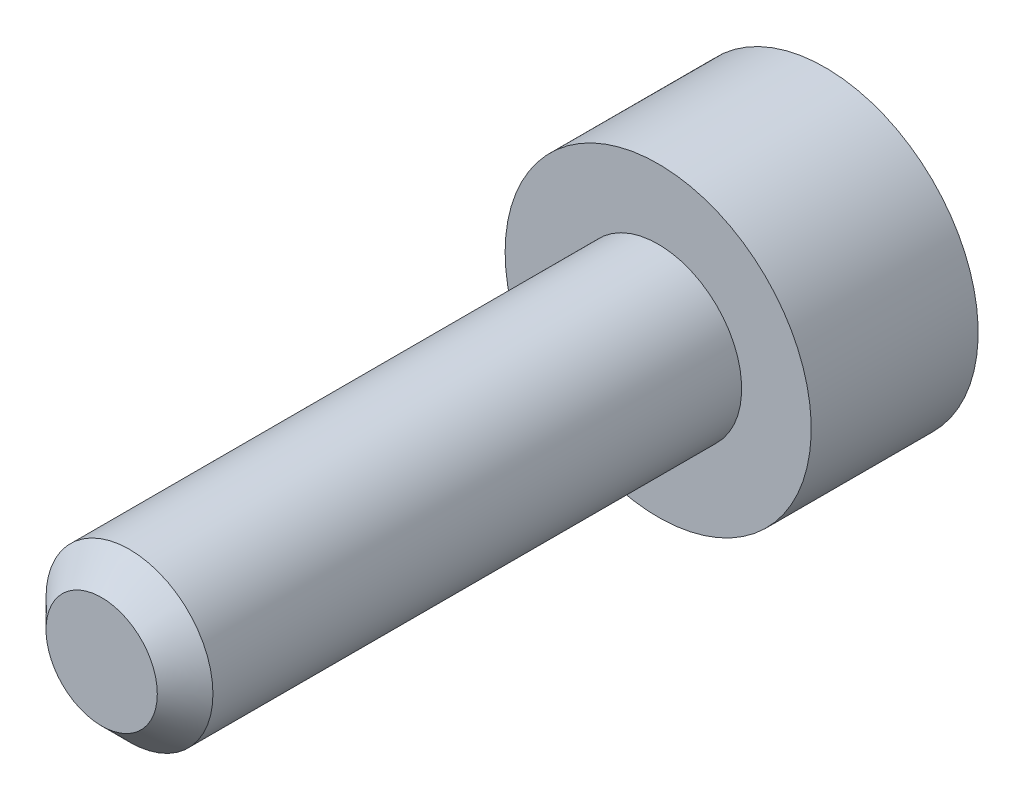
ISO-10303-21;
HEADER;
FILE_DESCRIPTION(('STEP AP214'),'2;1');
FILE_NAME('part.step','',(''),(''),'','','');
FILE_SCHEMA(('AUTOMOTIVE_DESIGN { 1 0 10303 214 1 1 1 1 }'));
ENDSEC;
DATA;
#1=APPLICATION_CONTEXT('core data for automotive mechanical design processes');
#2=APPLICATION_PROTOCOL_DEFINITION('international standard','automotive_design',2000,#1);
#3=PRODUCT_CONTEXT('',#1,'mechanical');
#4=PRODUCT('Part','Part','',(#3));
#5=PRODUCT_RELATED_PRODUCT_CATEGORY('part','',(#4));
#6=PRODUCT_DEFINITION_FORMATION('','',#4);
#7=PRODUCT_DEFINITION_CONTEXT('part definition',#1,'design');
#8=PRODUCT_DEFINITION('design','',#6,#7);
#9=PRODUCT_DEFINITION_SHAPE('','',#8);
#10=(LENGTH_UNIT() NAMED_UNIT(*) SI_UNIT(.MILLI.,.METRE.));
#11=(NAMED_UNIT(*) PLANE_ANGLE_UNIT() SI_UNIT($,.RADIAN.));
#12=(NAMED_UNIT(*) SI_UNIT($,.STERADIAN.) SOLID_ANGLE_UNIT());
#13=UNCERTAINTY_MEASURE_WITH_UNIT(LENGTH_MEASURE(1.E-05),#10,'distance_accuracy_value','');
#14=(GEOMETRIC_REPRESENTATION_CONTEXT(3) GLOBAL_UNCERTAINTY_ASSIGNED_CONTEXT((#13)) GLOBAL_UNIT_ASSIGNED_CONTEXT((#10,
#11,#12)) REPRESENTATION_CONTEXT('',''));
#15=CARTESIAN_POINT('',(0.,0.,0.));
#16=DIRECTION('',(0.,0.,1.));
#17=DIRECTION('',(1.,0.,0.));
#18=AXIS2_PLACEMENT_3D('',#15,#16,#17);
#19=CARTESIAN_POINT('',(0.,0.,10.));
#20=DIRECTION('',(0.,0.,-1.));
#21=DIRECTION('',(-1.,0.,0.));
#22=AXIS2_PLACEMENT_3D('',#19,#20,#21);
#23=CYLINDRICAL_SURFACE('',#22,1.5);
#24=CARTESIAN_POINT('',(0.,0.,9.5));
#25=DIRECTION('',(0.,0.,1.));
#26=DIRECTION('',(1.,0.,0.));
#27=AXIS2_PLACEMENT_3D('',#24,#25,#26);
#28=CIRCLE('',#27,1.5);
#29=CARTESIAN_POINT('',(1.5,0.,9.5));
#30=VERTEX_POINT('',#29);
#31=EDGE_CURVE('E10',#30,#30,#28,.F.);
#32=ORIENTED_EDGE('',*,*,#31,.T.);
#33=EDGE_LOOP('',(#32));
#34=FACE_BOUND('',#33,.T.);
#35=CARTESIAN_POINT('',(0.,0.,0.));
#36=DIRECTION('',(0.,0.,-1.));
#37=DIRECTION('',(-1.,0.,0.));
#38=AXIS2_PLACEMENT_3D('',#35,#36,#37);
#39=CIRCLE('',#38,1.5);
#40=CARTESIAN_POINT('',(-1.5,0.,0.));
#41=VERTEX_POINT('',#40);
#42=EDGE_CURVE('E39',#41,#41,#39,.T.);
#43=ORIENTED_EDGE('',*,*,#42,.F.);
#44=EDGE_LOOP('',(#43));
#45=FACE_BOUND('',#44,.T.);
#46=ADVANCED_FACE('F28',(#34,#45),#23,.T.);
#47=CARTESIAN_POINT('',(0.,0.,10.));
#48=DIRECTION('',(0.,0.,1.));
#49=DIRECTION('',(1.,0.,0.));
#50=AXIS2_PLACEMENT_3D('',#47,#48,#49);
#51=PLANE('',#50);
#52=CARTESIAN_POINT('',(0.,0.,10.));
#53=DIRECTION('',(0.,0.,1.));
#54=DIRECTION('',(1.,0.,0.));
#55=AXIS2_PLACEMENT_3D('',#52,#53,#54);
#56=CIRCLE('',#55,1.);
#57=CARTESIAN_POINT('',(1.,0.,10.));
#58=VERTEX_POINT('',#57);
#59=EDGE_CURVE('E35',#58,#58,#56,.T.);
#60=ORIENTED_EDGE('',*,*,#59,.T.);
#61=EDGE_LOOP('',(#60));
#62=FACE_BOUND('',#61,.T.);
#63=ADVANCED_FACE('F63',(#62),#51,.T.);
#64=CARTESIAN_POINT('',(0.,0.,0.));
#65=DIRECTION('',(0.,0.,-1.));
#66=DIRECTION('',(-1.,0.,0.));
#67=AXIS2_PLACEMENT_3D('',#64,#65,#66);
#68=PLANE('',#67);
#69=CARTESIAN_POINT('',(0.,0.,0.));
#70=DIRECTION('',(0.,0.,-1.));
#71=DIRECTION('',(-1.,0.,0.));
#72=AXIS2_PLACEMENT_3D('',#69,#70,#71);
#73=CIRCLE('',#72,2.75);
#74=CARTESIAN_POINT('',(-2.75,0.,0.));
#75=VERTEX_POINT('',#74);
#76=EDGE_CURVE('E46',#75,#75,#73,.T.);
#77=ORIENTED_EDGE('',*,*,#76,.F.);
#78=EDGE_LOOP('',(#77));
#79=FACE_BOUND('',#78,.T.);
#80=ORIENTED_EDGE('',*,*,#42,.T.);
#81=EDGE_LOOP('',(#80));
#82=FACE_BOUND('',#81,.T.);
#83=ADVANCED_FACE('F57',(#79,#82),#68,.F.);
#84=CARTESIAN_POINT('',(0.,0.,-3.));
#85=DIRECTION('',(0.,0.,1.));
#86=DIRECTION('',(1.,0.,0.));
#87=AXIS2_PLACEMENT_3D('',#84,#85,#86);
#88=CYLINDRICAL_SURFACE('',#87,2.75);
#89=CARTESIAN_POINT('',(0.,0.,-3.));
#90=DIRECTION('',(0.,0.,-1.));
#91=DIRECTION('',(-1.,0.,0.));
#92=AXIS2_PLACEMENT_3D('',#89,#90,#91);
#93=CIRCLE('',#92,2.75);
#94=CARTESIAN_POINT('',(-2.75,0.,-3.));
#95=VERTEX_POINT('',#94);
#96=EDGE_CURVE('E43',#95,#95,#93,.T.);
#97=ORIENTED_EDGE('',*,*,#96,.F.);
#98=EDGE_LOOP('',(#97));
#99=FACE_BOUND('',#98,.T.);
#100=ORIENTED_EDGE('',*,*,#76,.T.);
#101=EDGE_LOOP('',(#100));
#102=FACE_BOUND('',#101,.T.);
#103=ADVANCED_FACE('F54',(#99,#102),#88,.T.);
#104=CARTESIAN_POINT('',(0.,0.,-3.));
#105=DIRECTION('',(0.,0.,-1.));
#106=DIRECTION('',(-1.,0.,0.));
#107=AXIS2_PLACEMENT_3D('',#104,#105,#106);
#108=PLANE('',#107);
#109=ORIENTED_EDGE('',*,*,#96,.T.);
#110=EDGE_LOOP('',(#109));
#111=FACE_BOUND('',#110,.T.);
#112=ADVANCED_FACE('F52',(#111),#108,.T.);
#113=CARTESIAN_POINT('',(0.,0.,10.));
#114=DIRECTION('',(0.,0.,-1.));
#115=DIRECTION('',(-1.,0.,0.));
#116=AXIS2_PLACEMENT_3D('',#113,#114,#115);
#117=CONICAL_SURFACE('',#116,1.,0.785398163397447);
#118=ORIENTED_EDGE('',*,*,#31,.F.);
#119=EDGE_LOOP('',(#118));
#120=FACE_BOUND('',#119,.T.);
#121=ORIENTED_EDGE('',*,*,#59,.F.);
#122=EDGE_LOOP('',(#121));
#123=FACE_BOUND('',#122,.T.);
#124=ADVANCED_FACE('F30',(#120,#123),#117,.T.);
#125=CLOSED_SHELL('',(#46,#63,#83,#103,#112,#124));
#126=MANIFOLD_SOLID_BREP('B2',#125);
#127=ADVANCED_BREP_SHAPE_REPRESENTATION('',(#18,#126),#14);
#128=SHAPE_DEFINITION_REPRESENTATION(#9,#127);
ENDSEC;
END-ISO-10303-21;
